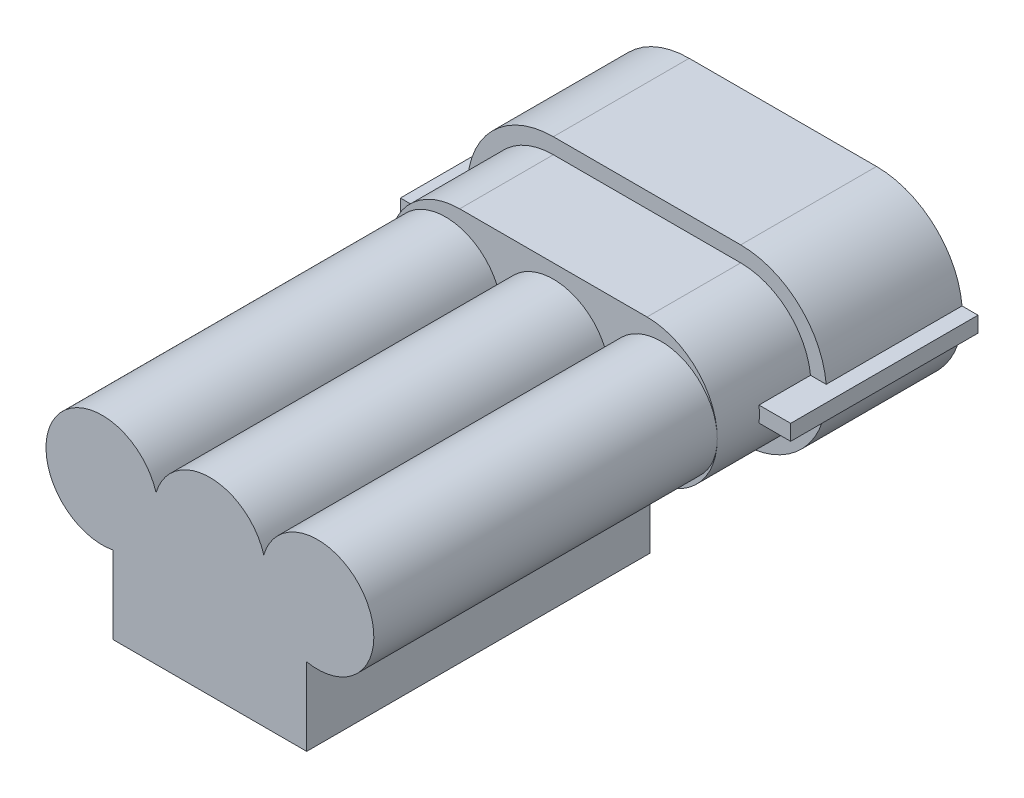
ISO-10303-21;
HEADER;
FILE_DESCRIPTION(('STEP AP214'),'2;1');
FILE_NAME('part.step','',(''),(''),'','','');
FILE_SCHEMA(('AUTOMOTIVE_DESIGN { 1 0 10303 214 1 1 1 1 }'));
ENDSEC;
DATA;
#1=APPLICATION_CONTEXT('core data for automotive mechanical design processes');
#2=APPLICATION_PROTOCOL_DEFINITION('international standard','automotive_design',2000,#1);
#3=PRODUCT_CONTEXT('',#1,'mechanical');
#4=PRODUCT('Part','Part','',(#3));
#5=PRODUCT_RELATED_PRODUCT_CATEGORY('part','',(#4));
#6=PRODUCT_DEFINITION_FORMATION('','',#4);
#7=PRODUCT_DEFINITION_CONTEXT('part definition',#1,'design');
#8=PRODUCT_DEFINITION('design','',#6,#7);
#9=PRODUCT_DEFINITION_SHAPE('','',#8);
#10=(LENGTH_UNIT() NAMED_UNIT(*) SI_UNIT(.MILLI.,.METRE.));
#11=(NAMED_UNIT(*) PLANE_ANGLE_UNIT() SI_UNIT($,.RADIAN.));
#12=(NAMED_UNIT(*) SI_UNIT($,.STERADIAN.) SOLID_ANGLE_UNIT());
#13=UNCERTAINTY_MEASURE_WITH_UNIT(LENGTH_MEASURE(1.E-05),#10,'distance_accuracy_value','');
#14=(GEOMETRIC_REPRESENTATION_CONTEXT(3) GLOBAL_UNCERTAINTY_ASSIGNED_CONTEXT((#13)) GLOBAL_UNIT_ASSIGNED_CONTEXT((#10,
#11,#12)) REPRESENTATION_CONTEXT('',''));
#15=CARTESIAN_POINT('',(0.,0.,0.));
#16=DIRECTION('',(0.,0.,1.));
#17=DIRECTION('',(1.,0.,0.));
#18=AXIS2_PLACEMENT_3D('',#15,#16,#17);
#19=CARTESIAN_POINT('',(-6.,-5.5,8.7));
#20=DIRECTION('',(0.,1.,0.));
#21=DIRECTION('',(0.,0.,1.));
#22=AXIS2_PLACEMENT_3D('',#19,#20,#21);
#23=PLANE('',#22);
#24=DIRECTION('',(1.,0.,0.));
#25=VECTOR('',#24,1.);
#26=CARTESIAN_POINT('',(6.20000000000001,-5.5,14.7));
#27=LINE('',#26,#25);
#28=CARTESIAN_POINT('',(-6.19999999999999,-5.5,14.7));
#29=VERTEX_POINT('',#28);
#30=CARTESIAN_POINT('',(6.20000000000001,-5.5,14.7));
#31=VERTEX_POINT('',#30);
#32=EDGE_CURVE('E60',#29,#31,#27,.T.);
#33=ORIENTED_EDGE('',*,*,#32,.F.);
#34=DIRECTION('',(0.,0.,-1.));
#35=VECTOR('',#34,1.);
#36=CARTESIAN_POINT('',(-6.2,-5.5,36.7));
#37=LINE('',#36,#35);
#38=CARTESIAN_POINT('',(-6.19999999999999,-5.5,0.));
#39=VERTEX_POINT('',#38);
#40=EDGE_CURVE('E405',#29,#39,#37,.T.);
#41=ORIENTED_EDGE('',*,*,#40,.T.);
#42=DIRECTION('',(1.,0.,0.));
#43=VECTOR('',#42,1.);
#44=CARTESIAN_POINT('',(-6.,-5.5,0.));
#45=LINE('',#44,#43);
#46=CARTESIAN_POINT('',(6.2,-5.5,0.));
#47=VERTEX_POINT('',#46);
#48=EDGE_CURVE('E509',#39,#47,#45,.T.);
#49=ORIENTED_EDGE('',*,*,#48,.T.);
#50=DIRECTION('',(0.,0.,1.));
#51=VECTOR('',#50,1.);
#52=CARTESIAN_POINT('',(6.2,-5.5,36.7));
#53=LINE('',#52,#51);
#54=EDGE_CURVE('E401',#47,#31,#53,.T.);
#55=ORIENTED_EDGE('',*,*,#54,.T.);
#56=EDGE_LOOP('',(#33,#41,#49,#55));
#57=FACE_BOUND('',#56,.T.);
#58=ADVANCED_FACE('F41',(#57),#23,.F.);
#59=CARTESIAN_POINT('',(-6.,0.,8.7));
#60=DIRECTION('',(0.,0.,1.));
#61=DIRECTION('',(1.,0.,0.));
#62=AXIS2_PLACEMENT_3D('',#59,#60,#61);
#63=PLANE('',#62);
#64=CARTESIAN_POINT('',(-6.,0.,8.7));
#65=DIRECTION('',(0.,0.,1.));
#66=DIRECTION('',(1.,0.,0.));
#67=AXIS2_PLACEMENT_3D('',#64,#65,#66);
#68=CIRCLE('',#67,4.5);
#69=CARTESIAN_POINT('',(-10.4721359549996,-0.500000000000002,8.7));
#70=VERTEX_POINT('',#69);
#71=CARTESIAN_POINT('',(-6.19999999999999,-4.4955533585978,8.7));
#72=VERTEX_POINT('',#71);
#73=EDGE_CURVE('E458',#70,#72,#68,.T.);
#74=ORIENTED_EDGE('',*,*,#73,.F.);
#75=DIRECTION('',(1.,0.,0.));
#76=VECTOR('',#75,1.);
#77=CARTESIAN_POINT('',(12.502,-0.500000000000001,8.7));
#78=LINE('',#77,#76);
#79=CARTESIAN_POINT('',(-11.4772255750517,-0.500000000000001,8.7));
#80=VERTEX_POINT('',#79);
#81=EDGE_CURVE('E68',#80,#70,#78,.T.);
#82=ORIENTED_EDGE('',*,*,#81,.F.);
#83=CARTESIAN_POINT('',(-6.,0.,8.7));
#84=DIRECTION('',(0.,0.,1.));
#85=DIRECTION('',(1.,0.,0.));
#86=AXIS2_PLACEMENT_3D('',#83,#84,#85);
#87=CIRCLE('',#86,5.5);
#88=CARTESIAN_POINT('',(-6.19999999999999,-5.49636243346452,8.7));
#89=VERTEX_POINT('',#88);
#90=EDGE_CURVE('E497',#80,#89,#87,.T.);
#91=ORIENTED_EDGE('',*,*,#90,.T.);
#92=DIRECTION('',(0.,1.,0.));
#93=VECTOR('',#92,1.);
#94=CARTESIAN_POINT('',(-6.2,5.502,8.7));
#95=LINE('',#94,#93);
#96=EDGE_CURVE('E362',#89,#72,#95,.T.);
#97=ORIENTED_EDGE('',*,*,#96,.T.);
#98=EDGE_LOOP('',(#74,#82,#91,#97));
#99=FACE_BOUND('',#98,.T.);
#100=ADVANCED_FACE('F590',(#99),#63,.T.);
#101=CARTESIAN_POINT('',(-6.,5.5,8.7));
#102=VERTEX_POINT('',#101);
#103=CARTESIAN_POINT('',(-11.4772255750517,0.499999999999999,8.7));
#104=VERTEX_POINT('',#103);
#105=EDGE_CURVE('E492',#102,#104,#87,.T.);
#106=ORIENTED_EDGE('',*,*,#105,.T.);
#107=DIRECTION('',(-1.,0.,0.));
#108=VECTOR('',#107,1.);
#109=CARTESIAN_POINT('',(12.502,0.499999999999999,8.7));
#110=LINE('',#109,#108);
#111=CARTESIAN_POINT('',(-10.4721359549996,0.499999999999999,8.7));
#112=VERTEX_POINT('',#111);
#113=EDGE_CURVE('E283',#112,#104,#110,.T.);
#114=ORIENTED_EDGE('',*,*,#113,.F.);
#115=CARTESIAN_POINT('',(-6.,4.5,8.7));
#116=VERTEX_POINT('',#115);
#117=EDGE_CURVE('E472',#116,#112,#68,.T.);
#118=ORIENTED_EDGE('',*,*,#117,.F.);
#119=DIRECTION('',(-1.,0.,0.));
#120=VECTOR('',#119,1.);
#121=CARTESIAN_POINT('',(6.,4.5,8.7));
#122=LINE('',#121,#120);
#123=CARTESIAN_POINT('',(6.,4.5,8.7));
#124=VERTEX_POINT('',#123);
#125=EDGE_CURVE('E480',#124,#116,#122,.T.);
#126=ORIENTED_EDGE('',*,*,#125,.F.);
#127=CARTESIAN_POINT('',(6.,0.,8.7));
#128=DIRECTION('',(0.,0.,1.));
#129=DIRECTION('',(1.,0.,0.));
#130=AXIS2_PLACEMENT_3D('',#127,#128,#129);
#131=CIRCLE('',#130,4.5);
#132=CARTESIAN_POINT('',(10.4721359549996,0.499999999999999,8.7));
#133=VERTEX_POINT('',#132);
#134=EDGE_CURVE('E475',#133,#124,#131,.T.);
#135=ORIENTED_EDGE('',*,*,#134,.F.);
#136=DIRECTION('',(1.,0.,0.));
#137=VECTOR('',#136,1.);
#138=CARTESIAN_POINT('',(-11.502,0.499999999999999,8.7));
#139=LINE('',#138,#137);
#140=CARTESIAN_POINT('',(11.4772255750517,0.499999999999999,8.7));
#141=VERTEX_POINT('',#140);
#142=EDGE_CURVE('E334',#133,#141,#139,.T.);
#143=ORIENTED_EDGE('',*,*,#142,.T.);
#144=CARTESIAN_POINT('',(6.,0.,8.7));
#145=DIRECTION('',(0.,0.,1.));
#146=DIRECTION('',(1.,0.,0.));
#147=AXIS2_PLACEMENT_3D('',#144,#145,#146);
#148=CIRCLE('',#147,5.5);
#149=CARTESIAN_POINT('',(6.,5.5,8.7));
#150=VERTEX_POINT('',#149);
#151=EDGE_CURVE('E496',#141,#150,#148,.T.);
#152=ORIENTED_EDGE('',*,*,#151,.T.);
#153=DIRECTION('',(-1.,0.,0.));
#154=VECTOR('',#153,1.);
#155=CARTESIAN_POINT('',(-6.,5.5,8.7));
#156=LINE('',#155,#154);
#157=EDGE_CURVE('E502',#150,#102,#156,.T.);
#158=ORIENTED_EDGE('',*,*,#157,.T.);
#159=EDGE_LOOP('',(#106,#114,#118,#126,#135,#143,#152,#158));
#160=FACE_BOUND('',#159,.T.);
#161=ADVANCED_FACE('F560',(#160),#63,.T.);
#162=CARTESIAN_POINT('',(-6.,0.,8.7));
#163=DIRECTION('',(0.,0.,-1.));
#164=DIRECTION('',(-1.,0.,0.));
#165=AXIS2_PLACEMENT_3D('',#162,#163,#164);
#166=CYLINDRICAL_SURFACE('',#165,5.5);
#167=DIRECTION('',(0.,0.,-1.));
#168=VECTOR('',#167,1.);
#169=CARTESIAN_POINT('',(-11.4772255750517,-0.500000000000001,8.7));
#170=LINE('',#169,#168);
#171=CARTESIAN_POINT('',(-11.4772255750517,-0.5,0.));
#172=VERTEX_POINT('',#171);
#173=EDGE_CURVE('E319',#80,#172,#170,.T.);
#174=ORIENTED_EDGE('',*,*,#173,.T.);
#175=CARTESIAN_POINT('',(-6.,0.,0.));
#176=DIRECTION('',(0.,0.,1.));
#177=DIRECTION('',(1.,0.,0.));
#178=AXIS2_PLACEMENT_3D('',#175,#176,#177);
#179=CIRCLE('',#178,5.5);
#180=CARTESIAN_POINT('',(-6.19999999999999,-5.49636243346452,0.));
#181=VERTEX_POINT('',#180);
#182=EDGE_CURVE('E491',#172,#181,#179,.T.);
#183=ORIENTED_EDGE('',*,*,#182,.T.);
#184=DIRECTION('',(0.,0.,-1.));
#185=VECTOR('',#184,1.);
#186=CARTESIAN_POINT('',(-6.19999999999999,-5.49636243346452,8.7));
#187=LINE('',#186,#185);
#188=EDGE_CURVE('E249',#89,#181,#187,.T.);
#189=ORIENTED_EDGE('',*,*,#188,.F.);
#190=ORIENTED_EDGE('',*,*,#90,.F.);
#191=EDGE_LOOP('',(#174,#183,#189,#190));
#192=FACE_BOUND('',#191,.T.);
#193=ADVANCED_FACE('F43',(#192),#166,.T.);
#194=DIRECTION('',(0.,0.,-1.));
#195=VECTOR('',#194,1.);
#196=CARTESIAN_POINT('',(-11.4772255750517,0.499999999999999,8.7));
#197=LINE('',#196,#195);
#198=CARTESIAN_POINT('',(-11.4772255750517,0.5,0.));
#199=VERTEX_POINT('',#198);
#200=EDGE_CURVE('E280',#199,#104,#197,.F.);
#201=ORIENTED_EDGE('',*,*,#200,.T.);
#202=ORIENTED_EDGE('',*,*,#105,.F.);
#203=DIRECTION('',(0.,0.,-1.));
#204=VECTOR('',#203,1.);
#205=CARTESIAN_POINT('',(-6.,5.5,8.7));
#206=LINE('',#205,#204);
#207=CARTESIAN_POINT('',(-6.,5.5,0.));
#208=VERTEX_POINT('',#207);
#209=EDGE_CURVE('E505',#102,#208,#206,.T.);
#210=ORIENTED_EDGE('',*,*,#209,.T.);
#211=EDGE_CURVE('E506',#208,#199,#179,.T.);
#212=ORIENTED_EDGE('',*,*,#211,.T.);
#213=EDGE_LOOP('',(#201,#202,#210,#212));
#214=FACE_BOUND('',#213,.T.);
#215=ADVANCED_FACE('F603',(#214),#166,.T.);
#216=CARTESIAN_POINT('',(-6.,0.,14.7));
#217=DIRECTION('',(0.,0.,-1.));
#218=DIRECTION('',(-1.,0.,0.));
#219=AXIS2_PLACEMENT_3D('',#216,#217,#218);
#220=CYLINDRICAL_SURFACE('',#219,4.5);
#221=DIRECTION('',(0.,0.,-1.));
#222=VECTOR('',#221,1.);
#223=CARTESIAN_POINT('',(-10.4721359549996,-0.500000000000002,14.7));
#224=LINE('',#223,#222);
#225=CARTESIAN_POINT('',(-10.4721359549996,-0.500000000000002,12.));
#226=VERTEX_POINT('',#225);
#227=EDGE_CURVE('E284',#226,#70,#224,.T.);
#228=ORIENTED_EDGE('',*,*,#227,.T.);
#229=ORIENTED_EDGE('',*,*,#73,.T.);
#230=DIRECTION('',(0.,0.,-1.));
#231=VECTOR('',#230,1.);
#232=CARTESIAN_POINT('',(-6.19999999999999,-4.4955533585978,14.7));
#233=LINE('',#232,#231);
#234=CARTESIAN_POINT('',(-6.19999999999999,-4.4955533585978,14.7));
#235=VERTEX_POINT('',#234);
#236=EDGE_CURVE('E389',#235,#72,#233,.T.);
#237=ORIENTED_EDGE('',*,*,#236,.F.);
#238=CARTESIAN_POINT('',(-6.,0.,14.7));
#239=DIRECTION('',(0.,0.,1.));
#240=DIRECTION('',(1.,0.,0.));
#241=AXIS2_PLACEMENT_3D('',#238,#239,#240);
#242=CIRCLE('',#241,4.5);
#243=CARTESIAN_POINT('',(-10.5,0.,14.7));
#244=VERTEX_POINT('',#243);
#245=EDGE_CURVE('E464',#244,#235,#242,.T.);
#246=ORIENTED_EDGE('',*,*,#245,.F.);
#247=CARTESIAN_POINT('',(-6.,4.5,14.7));
#248=VERTEX_POINT('',#247);
#249=EDGE_CURVE('E459',#248,#244,#242,.T.);
#250=ORIENTED_EDGE('',*,*,#249,.F.);
#251=DIRECTION('',(0.,0.,-1.));
#252=VECTOR('',#251,1.);
#253=CARTESIAN_POINT('',(-6.,4.5,14.7));
#254=LINE('',#253,#252);
#255=EDGE_CURVE('E471',#248,#116,#254,.T.);
#256=ORIENTED_EDGE('',*,*,#255,.T.);
#257=ORIENTED_EDGE('',*,*,#117,.T.);
#258=DIRECTION('',(0.,0.,-1.));
#259=VECTOR('',#258,1.);
#260=CARTESIAN_POINT('',(-10.4721359549996,0.499999999999998,14.7));
#261=LINE('',#260,#259);
#262=CARTESIAN_POINT('',(-10.4721359549996,0.499999999999998,12.));
#263=VERTEX_POINT('',#262);
#264=EDGE_CURVE('E325',#112,#263,#261,.F.);
#265=ORIENTED_EDGE('',*,*,#264,.T.);
#266=CARTESIAN_POINT('',(-6.,0.,12.));
#267=DIRECTION('',(0.,0.,-1.));
#268=DIRECTION('',(-1.,0.,0.));
#269=AXIS2_PLACEMENT_3D('',#266,#267,#268);
#270=CIRCLE('',#269,4.5);
#271=EDGE_CURVE('E322',#263,#226,#270,.F.);
#272=ORIENTED_EDGE('',*,*,#271,.T.);
#273=EDGE_LOOP('',(#228,#229,#237,#246,#250,#256,#257,#265,#272));
#274=FACE_BOUND('',#273,.T.);
#275=ADVANCED_FACE('F544',(#274),#220,.T.);
#276=CARTESIAN_POINT('',(6.,0.,8.7));
#277=DIRECTION('',(0.,0.,-1.));
#278=DIRECTION('',(-1.,0.,0.));
#279=AXIS2_PLACEMENT_3D('',#276,#277,#278);
#280=CYLINDRICAL_SURFACE('',#279,5.5);
#281=ORIENTED_EDGE('',*,*,#151,.F.);
#282=DIRECTION('',(0.,0.,-1.));
#283=VECTOR('',#282,1.);
#284=CARTESIAN_POINT('',(11.4772255750517,0.499999999999999,8.7));
#285=LINE('',#284,#283);
#286=CARTESIAN_POINT('',(11.4772255750517,0.5,0.));
#287=VERTEX_POINT('',#286);
#288=EDGE_CURVE('E333',#287,#141,#285,.F.);
#289=ORIENTED_EDGE('',*,*,#288,.F.);
#290=CARTESIAN_POINT('',(6.,0.,0.));
#291=DIRECTION('',(0.,0.,1.));
#292=DIRECTION('',(1.,0.,0.));
#293=AXIS2_PLACEMENT_3D('',#290,#291,#292);
#294=CIRCLE('',#293,5.5);
#295=CARTESIAN_POINT('',(6.,5.5,0.));
#296=VERTEX_POINT('',#295);
#297=EDGE_CURVE('E512',#287,#296,#294,.T.);
#298=ORIENTED_EDGE('',*,*,#297,.T.);
#299=DIRECTION('',(0.,0.,-1.));
#300=VECTOR('',#299,1.);
#301=CARTESIAN_POINT('',(6.,5.5,8.7));
#302=LINE('',#301,#300);
#303=EDGE_CURVE('E45',#150,#296,#302,.T.);
#304=ORIENTED_EDGE('',*,*,#303,.F.);
#305=EDGE_LOOP('',(#281,#289,#298,#304));
#306=FACE_BOUND('',#305,.T.);
#307=ADVANCED_FACE('F598',(#306),#280,.T.);
#308=CARTESIAN_POINT('',(-6.,0.,14.7));
#309=DIRECTION('',(0.,0.,1.));
#310=DIRECTION('',(1.,0.,0.));
#311=AXIS2_PLACEMENT_3D('',#308,#309,#310);
#312=PLANE('',#311);
#313=DIRECTION('',(0.,1.,0.));
#314=VECTOR('',#313,1.);
#315=CARTESIAN_POINT('',(-6.2,5.502,14.7));
#316=LINE('',#315,#314);
#317=CARTESIAN_POINT('',(-6.19999999999999,-3.53128871660191,14.7));
#318=VERTEX_POINT('',#317);
#319=EDGE_CURVE('E425',#235,#318,#316,.T.);
#320=ORIENTED_EDGE('',*,*,#319,.T.);
#321=CARTESIAN_POINT('',(-6.9,0.,14.7));
#322=DIRECTION('',(0.,0.,1.));
#323=DIRECTION('',(1.,0.,0.));
#324=AXIS2_PLACEMENT_3D('',#321,#322,#323);
#325=CIRCLE('',#324,3.6);
#326=EDGE_CURVE('E51',#244,#318,#325,.T.);
#327=ORIENTED_EDGE('',*,*,#326,.F.);
#328=ORIENTED_EDGE('',*,*,#245,.T.);
#329=EDGE_LOOP('',(#320,#327,#328));
#330=FACE_BOUND('',#329,.T.);
#331=ADVANCED_FACE('F540',(#330),#312,.T.);
#332=CARTESIAN_POINT('',(0.,0.,14.7));
#333=DIRECTION('',(0.,0.,1.));
#334=DIRECTION('',(1.,0.,0.));
#335=AXIS2_PLACEMENT_3D('',#332,#333,#334);
#336=CIRCLE('',#335,3.6);
#337=CARTESIAN_POINT('',(3.45,1.02834819006015,14.7));
#338=VERTEX_POINT('',#337);
#339=CARTESIAN_POINT('',(-3.45,1.02834819006016,14.7));
#340=VERTEX_POINT('',#339);
#341=EDGE_CURVE('E436',#338,#340,#336,.T.);
#342=ORIENTED_EDGE('',*,*,#341,.F.);
#343=CARTESIAN_POINT('',(6.9,0.,14.7));
#344=DIRECTION('',(0.,0.,1.));
#345=DIRECTION('',(1.,0.,0.));
#346=AXIS2_PLACEMENT_3D('',#343,#344,#345);
#347=CIRCLE('',#346,3.6);
#348=CARTESIAN_POINT('',(10.5,0.,14.7));
#349=VERTEX_POINT('',#348);
#350=EDGE_CURVE('E11',#349,#338,#347,.T.);
#351=ORIENTED_EDGE('',*,*,#350,.F.);
#352=CARTESIAN_POINT('',(6.,0.,14.7));
#353=DIRECTION('',(0.,0.,1.));
#354=DIRECTION('',(1.,0.,0.));
#355=AXIS2_PLACEMENT_3D('',#352,#353,#354);
#356=CIRCLE('',#355,4.5);
#357=CARTESIAN_POINT('',(6.,4.5,14.7));
#358=VERTEX_POINT('',#357);
#359=EDGE_CURVE('E463',#349,#358,#356,.T.);
#360=ORIENTED_EDGE('',*,*,#359,.T.);
#361=DIRECTION('',(-1.,0.,0.));
#362=VECTOR('',#361,1.);
#363=CARTESIAN_POINT('',(6.,4.5,14.7));
#364=LINE('',#363,#362);
#365=EDGE_CURVE('E468',#358,#248,#364,.T.);
#366=ORIENTED_EDGE('',*,*,#365,.T.);
#367=ORIENTED_EDGE('',*,*,#249,.T.);
#368=EDGE_CURVE('E404',#340,#244,#325,.T.);
#369=ORIENTED_EDGE('',*,*,#368,.F.);
#370=EDGE_LOOP('',(#342,#351,#360,#366,#367,#369));
#371=FACE_BOUND('',#370,.T.);
#372=ADVANCED_FACE('F547',(#371),#312,.T.);
#373=CARTESIAN_POINT('',(6.2,-5.49636243346452,0.));
#374=VERTEX_POINT('',#373);
#375=CARTESIAN_POINT('',(11.4772255750517,-0.5,0.));
#376=VERTEX_POINT('',#375);
#377=EDGE_CURVE('E513',#374,#376,#294,.T.);
#378=ORIENTED_EDGE('',*,*,#377,.T.);
#379=DIRECTION('',(0.,0.,-1.));
#380=VECTOR('',#379,1.);
#381=CARTESIAN_POINT('',(11.4772255750517,-0.500000000000001,8.7));
#382=LINE('',#381,#380);
#383=CARTESIAN_POINT('',(11.4772255750517,-0.500000000000001,8.7));
#384=VERTEX_POINT('',#383);
#385=EDGE_CURVE('E344',#384,#376,#382,.T.);
#386=ORIENTED_EDGE('',*,*,#385,.F.);
#387=CARTESIAN_POINT('',(6.2,-5.49636243346452,8.7));
#388=VERTEX_POINT('',#387);
#389=EDGE_CURVE('E498',#388,#384,#148,.T.);
#390=ORIENTED_EDGE('',*,*,#389,.F.);
#391=DIRECTION('',(0.,0.,-1.));
#392=VECTOR('',#391,1.);
#393=CARTESIAN_POINT('',(6.2,-5.49636243346452,8.7));
#394=LINE('',#393,#392);
#395=EDGE_CURVE('E390',#374,#388,#394,.F.);
#396=ORIENTED_EDGE('',*,*,#395,.F.);
#397=EDGE_LOOP('',(#378,#386,#390,#396));
#398=FACE_BOUND('',#397,.T.);
#399=ADVANCED_FACE('F625',(#398),#280,.T.);
#400=CARTESIAN_POINT('',(-6.,5.5,8.7));
#401=DIRECTION('',(0.,-1.,0.));
#402=DIRECTION('',(0.,0.,-1.));
#403=AXIS2_PLACEMENT_3D('',#400,#401,#402);
#404=PLANE('',#403);
#405=DIRECTION('',(-1.,0.,0.));
#406=VECTOR('',#405,1.);
#407=CARTESIAN_POINT('',(-6.,5.5,0.));
#408=LINE('',#407,#406);
#409=EDGE_CURVE('E517',#296,#208,#408,.T.);
#410=ORIENTED_EDGE('',*,*,#409,.T.);
#411=ORIENTED_EDGE('',*,*,#209,.F.);
#412=ORIENTED_EDGE('',*,*,#157,.F.);
#413=ORIENTED_EDGE('',*,*,#303,.T.);
#414=EDGE_LOOP('',(#410,#411,#412,#413));
#415=FACE_BOUND('',#414,.T.);
#416=ADVANCED_FACE('F602',(#415),#404,.F.);
#417=DIRECTION('',(-1.,0.,0.));
#418=VECTOR('',#417,1.);
#419=CARTESIAN_POINT('',(-11.502,-0.500000000000001,8.7));
#420=LINE('',#419,#418);
#421=CARTESIAN_POINT('',(10.4721359549996,-0.500000000000001,8.7));
#422=VERTEX_POINT('',#421);
#423=EDGE_CURVE('E303',#384,#422,#420,.T.);
#424=ORIENTED_EDGE('',*,*,#423,.T.);
#425=CARTESIAN_POINT('',(6.2,-4.4955533585978,8.7));
#426=VERTEX_POINT('',#425);
#427=EDGE_CURVE('E476',#426,#422,#131,.T.);
#428=ORIENTED_EDGE('',*,*,#427,.F.);
#429=DIRECTION('',(0.,-1.,0.));
#430=VECTOR('',#429,1.);
#431=CARTESIAN_POINT('',(6.2,5.502,8.7));
#432=LINE('',#431,#430);
#433=EDGE_CURVE('E421',#426,#388,#432,.T.);
#434=ORIENTED_EDGE('',*,*,#433,.T.);
#435=ORIENTED_EDGE('',*,*,#389,.T.);
#436=EDGE_LOOP('',(#424,#428,#434,#435));
#437=FACE_BOUND('',#436,.T.);
#438=ADVANCED_FACE('F623',(#437),#63,.T.);
#439=CARTESIAN_POINT('',(-6.,0.,0.));
#440=DIRECTION('',(0.,0.,1.));
#441=DIRECTION('',(1.,0.,0.));
#442=AXIS2_PLACEMENT_3D('',#439,#440,#441);
#443=PLANE('',#442);
#444=ORIENTED_EDGE('',*,*,#211,.F.);
#445=ORIENTED_EDGE('',*,*,#409,.F.);
#446=ORIENTED_EDGE('',*,*,#297,.F.);
#447=DIRECTION('',(1.,0.,0.));
#448=VECTOR('',#447,1.);
#449=CARTESIAN_POINT('',(-11.502,0.5,0.));
#450=LINE('',#449,#448);
#451=CARTESIAN_POINT('',(12.5,0.5,0.));
#452=VERTEX_POINT('',#451);
#453=EDGE_CURVE('E347',#287,#452,#450,.T.);
#454=ORIENTED_EDGE('',*,*,#453,.T.);
#455=DIRECTION('',(0.,1.,0.));
#456=VECTOR('',#455,1.);
#457=CARTESIAN_POINT('',(12.5,-0.5,0.));
#458=LINE('',#457,#456);
#459=CARTESIAN_POINT('',(12.5,-0.5,0.));
#460=VERTEX_POINT('',#459);
#461=EDGE_CURVE('E358',#460,#452,#458,.T.);
#462=ORIENTED_EDGE('',*,*,#461,.F.);
#463=DIRECTION('',(1.,0.,0.));
#464=VECTOR('',#463,1.);
#465=CARTESIAN_POINT('',(-11.502,-0.5,0.));
#466=LINE('',#465,#464);
#467=EDGE_CURVE('E357',#376,#460,#466,.T.);
#468=ORIENTED_EDGE('',*,*,#467,.F.);
#469=ORIENTED_EDGE('',*,*,#377,.F.);
#470=DIRECTION('',(0.,-1.,0.));
#471=VECTOR('',#470,1.);
#472=CARTESIAN_POINT('',(6.2,5.502,0.));
#473=LINE('',#472,#471);
#474=EDGE_CURVE('E407',#374,#47,#473,.T.);
#475=ORIENTED_EDGE('',*,*,#474,.T.);
#476=ORIENTED_EDGE('',*,*,#48,.F.);
#477=DIRECTION('',(0.,-1.,0.));
#478=VECTOR('',#477,1.);
#479=CARTESIAN_POINT('',(-6.19999999999999,5.502,0.));
#480=LINE('',#479,#478);
#481=EDGE_CURVE('E411',#181,#39,#480,.T.);
#482=ORIENTED_EDGE('',*,*,#481,.F.);
#483=ORIENTED_EDGE('',*,*,#182,.F.);
#484=DIRECTION('',(-1.,0.,0.));
#485=VECTOR('',#484,1.);
#486=CARTESIAN_POINT('',(12.502,-0.5,0.));
#487=LINE('',#486,#485);
#488=CARTESIAN_POINT('',(-12.5,-0.5,0.));
#489=VERTEX_POINT('',#488);
#490=EDGE_CURVE('E288',#172,#489,#487,.T.);
#491=ORIENTED_EDGE('',*,*,#490,.T.);
#492=DIRECTION('',(0.,1.,0.));
#493=VECTOR('',#492,1.);
#494=CARTESIAN_POINT('',(-12.5,-0.5,0.));
#495=LINE('',#494,#493);
#496=CARTESIAN_POINT('',(-12.5,0.5,0.));
#497=VERTEX_POINT('',#496);
#498=EDGE_CURVE('E299',#489,#497,#495,.T.);
#499=ORIENTED_EDGE('',*,*,#498,.T.);
#500=DIRECTION('',(-1.,0.,0.));
#501=VECTOR('',#500,1.);
#502=CARTESIAN_POINT('',(12.502,0.5,0.));
#503=LINE('',#502,#501);
#504=EDGE_CURVE('E298',#199,#497,#503,.T.);
#505=ORIENTED_EDGE('',*,*,#504,.F.);
#506=EDGE_LOOP('',(#444,#445,#446,#454,#462,#468,#469,#475,#476,#482,#483,#491,#499,#505));
#507=FACE_BOUND('',#506,.T.);
#508=ADVANCED_FACE('F581',(#507),#443,.F.);
#509=CARTESIAN_POINT('',(6.,0.,14.7));
#510=DIRECTION('',(0.,0.,-1.));
#511=DIRECTION('',(-1.,0.,0.));
#512=AXIS2_PLACEMENT_3D('',#509,#510,#511);
#513=CYLINDRICAL_SURFACE('',#512,4.5);
#514=CARTESIAN_POINT('',(6.,0.,12.));
#515=DIRECTION('',(0.,0.,1.));
#516=DIRECTION('',(1.,0.,0.));
#517=AXIS2_PLACEMENT_3D('',#514,#515,#516);
#518=CIRCLE('',#517,4.5);
#519=CARTESIAN_POINT('',(10.4721359549996,0.499999999999999,12.));
#520=VERTEX_POINT('',#519);
#521=CARTESIAN_POINT('',(10.4721359549996,-0.500000000000002,12.));
#522=VERTEX_POINT('',#521);
#523=EDGE_CURVE('E335',#520,#522,#518,.F.);
#524=ORIENTED_EDGE('',*,*,#523,.F.);
#525=DIRECTION('',(0.,0.,-1.));
#526=VECTOR('',#525,1.);
#527=CARTESIAN_POINT('',(10.4721359549996,0.499999999999998,14.7));
#528=LINE('',#527,#526);
#529=EDGE_CURVE('E330',#133,#520,#528,.F.);
#530=ORIENTED_EDGE('',*,*,#529,.F.);
#531=ORIENTED_EDGE('',*,*,#134,.T.);
#532=DIRECTION('',(0.,0.,-1.));
#533=VECTOR('',#532,1.);
#534=CARTESIAN_POINT('',(6.,4.5,14.7));
#535=LINE('',#534,#533);
#536=EDGE_CURVE('E487',#358,#124,#535,.T.);
#537=ORIENTED_EDGE('',*,*,#536,.F.);
#538=ORIENTED_EDGE('',*,*,#359,.F.);
#539=CARTESIAN_POINT('',(6.2,-4.4955533585978,14.7));
#540=VERTEX_POINT('',#539);
#541=EDGE_CURVE('E465',#540,#349,#356,.T.);
#542=ORIENTED_EDGE('',*,*,#541,.F.);
#543=DIRECTION('',(0.,0.,-1.));
#544=VECTOR('',#543,1.);
#545=CARTESIAN_POINT('',(6.2,-4.4955533585978,14.7));
#546=LINE('',#545,#544);
#547=EDGE_CURVE('E384',#426,#540,#546,.F.);
#548=ORIENTED_EDGE('',*,*,#547,.F.);
#549=ORIENTED_EDGE('',*,*,#427,.T.);
#550=DIRECTION('',(0.,0.,-1.));
#551=VECTOR('',#550,1.);
#552=CARTESIAN_POINT('',(10.4721359549996,-0.500000000000002,14.7));
#553=LINE('',#552,#551);
#554=EDGE_CURVE('E339',#522,#422,#553,.T.);
#555=ORIENTED_EDGE('',*,*,#554,.F.);
#556=EDGE_LOOP('',(#524,#530,#531,#537,#538,#542,#548,#549,#555));
#557=FACE_BOUND('',#556,.T.);
#558=ADVANCED_FACE('F632',(#557),#513,.T.);
#559=CARTESIAN_POINT('',(6.,4.5,14.7));
#560=DIRECTION('',(0.,-1.,0.));
#561=DIRECTION('',(1.,0.,0.));
#562=AXIS2_PLACEMENT_3D('',#559,#560,#561);
#563=PLANE('',#562);
#564=ORIENTED_EDGE('',*,*,#125,.T.);
#565=ORIENTED_EDGE('',*,*,#255,.F.);
#566=ORIENTED_EDGE('',*,*,#365,.F.);
#567=ORIENTED_EDGE('',*,*,#536,.T.);
#568=EDGE_LOOP('',(#564,#565,#566,#567));
#569=FACE_BOUND('',#568,.T.);
#570=ADVANCED_FACE('F554',(#569),#563,.F.);
#571=DIRECTION('',(0.,-1.,0.));
#572=VECTOR('',#571,1.);
#573=CARTESIAN_POINT('',(6.2,5.502,14.7));
#574=LINE('',#573,#572);
#575=CARTESIAN_POINT('',(6.2,-3.53128871660192,14.7));
#576=VERTEX_POINT('',#575);
#577=EDGE_CURVE('E385',#576,#540,#574,.T.);
#578=ORIENTED_EDGE('',*,*,#577,.T.);
#579=ORIENTED_EDGE('',*,*,#541,.T.);
#580=EDGE_CURVE('E53',#576,#349,#347,.T.);
#581=ORIENTED_EDGE('',*,*,#580,.F.);
#582=EDGE_LOOP('',(#578,#579,#581));
#583=FACE_BOUND('',#582,.T.);
#584=ADVANCED_FACE('F643',(#583),#312,.T.);
#585=CARTESIAN_POINT('',(-6.9,0.,36.7));
#586=DIRECTION('',(0.,0.,-1.));
#587=DIRECTION('',(-1.,0.,0.));
#588=AXIS2_PLACEMENT_3D('',#585,#586,#587);
#589=CYLINDRICAL_SURFACE('',#588,3.6);
#590=ORIENTED_EDGE('',*,*,#326,.T.);
#591=DIRECTION('',(0.,0.,-1.));
#592=VECTOR('',#591,1.);
#593=CARTESIAN_POINT('',(-6.2,-3.53128871660191,36.7));
#594=LINE('',#593,#592);
#595=CARTESIAN_POINT('',(-6.2,-3.53128871660191,36.7));
#596=VERTEX_POINT('',#595);
#597=EDGE_CURVE('E393',#596,#318,#594,.T.);
#598=ORIENTED_EDGE('',*,*,#597,.F.);
#599=CARTESIAN_POINT('',(-6.9,0.,36.7));
#600=DIRECTION('',(0.,0.,1.));
#601=DIRECTION('',(1.,0.,0.));
#602=AXIS2_PLACEMENT_3D('',#599,#600,#601);
#603=CIRCLE('',#602,3.6);
#604=CARTESIAN_POINT('',(-3.45,1.02834819006016,36.7));
#605=VERTEX_POINT('',#604);
#606=EDGE_CURVE('E432',#605,#596,#603,.T.);
#607=ORIENTED_EDGE('',*,*,#606,.F.);
#608=DIRECTION('',(0.,0.,-1.));
#609=VECTOR('',#608,1.);
#610=CARTESIAN_POINT('',(-3.45,1.02834819006016,36.7));
#611=LINE('',#610,#609);
#612=EDGE_CURVE('E442',#605,#340,#611,.T.);
#613=ORIENTED_EDGE('',*,*,#612,.T.);
#614=ORIENTED_EDGE('',*,*,#368,.T.);
#615=EDGE_LOOP('',(#590,#598,#607,#613,#614));
#616=FACE_BOUND('',#615,.T.);
#617=ADVANCED_FACE('F535',(#616),#589,.T.);
#618=CARTESIAN_POINT('',(6.9,0.,36.7));
#619=DIRECTION('',(0.,0.,-1.));
#620=DIRECTION('',(-1.,0.,0.));
#621=AXIS2_PLACEMENT_3D('',#618,#619,#620);
#622=CYLINDRICAL_SURFACE('',#621,3.6);
#623=CARTESIAN_POINT('',(6.9,0.,36.7));
#624=DIRECTION('',(0.,0.,1.));
#625=DIRECTION('',(1.,0.,0.));
#626=AXIS2_PLACEMENT_3D('',#623,#624,#625);
#627=CIRCLE('',#626,3.6);
#628=CARTESIAN_POINT('',(6.2,-3.53128871660192,36.7));
#629=VERTEX_POINT('',#628);
#630=CARTESIAN_POINT('',(3.45,1.02834819006015,36.7));
#631=VERTEX_POINT('',#630);
#632=EDGE_CURVE('E435',#629,#631,#627,.T.);
#633=ORIENTED_EDGE('',*,*,#632,.F.);
#634=DIRECTION('',(0.,0.,-1.));
#635=VECTOR('',#634,1.);
#636=CARTESIAN_POINT('',(6.2,-3.53128871660192,36.7));
#637=LINE('',#636,#635);
#638=EDGE_CURVE('E244',#576,#629,#637,.F.);
#639=ORIENTED_EDGE('',*,*,#638,.F.);
#640=ORIENTED_EDGE('',*,*,#580,.T.);
#641=ORIENTED_EDGE('',*,*,#350,.T.);
#642=DIRECTION('',(0.,0.,-1.));
#643=VECTOR('',#642,1.);
#644=CARTESIAN_POINT('',(3.45,1.02834819006015,36.7));
#645=LINE('',#644,#643);
#646=EDGE_CURVE('E454',#631,#338,#645,.T.);
#647=ORIENTED_EDGE('',*,*,#646,.F.);
#648=EDGE_LOOP('',(#633,#639,#640,#641,#647));
#649=FACE_BOUND('',#648,.T.);
#650=ADVANCED_FACE('F649',(#649),#622,.T.);
#651=CARTESIAN_POINT('',(0.,0.,36.7));
#652=DIRECTION('',(0.,0.,-1.));
#653=DIRECTION('',(-1.,0.,0.));
#654=AXIS2_PLACEMENT_3D('',#651,#652,#653);
#655=CYLINDRICAL_SURFACE('',#654,3.6);
#656=ORIENTED_EDGE('',*,*,#341,.T.);
#657=ORIENTED_EDGE('',*,*,#612,.F.);
#658=CARTESIAN_POINT('',(0.,0.,36.7));
#659=DIRECTION('',(0.,0.,1.));
#660=DIRECTION('',(1.,0.,0.));
#661=AXIS2_PLACEMENT_3D('',#658,#659,#660);
#662=CIRCLE('',#661,3.6);
#663=EDGE_CURVE('E439',#631,#605,#662,.T.);
#664=ORIENTED_EDGE('',*,*,#663,.F.);
#665=ORIENTED_EDGE('',*,*,#646,.T.);
#666=EDGE_LOOP('',(#656,#657,#664,#665));
#667=FACE_BOUND('',#666,.T.);
#668=ADVANCED_FACE('F652',(#667),#655,.T.);
#669=CARTESIAN_POINT('',(0.,0.,36.7));
#670=DIRECTION('',(0.,0.,1.));
#671=DIRECTION('',(1.,0.,0.));
#672=AXIS2_PLACEMENT_3D('',#669,#670,#671);
#673=PLANE('',#672);
#674=DIRECTION('',(0.,-1.,0.));
#675=VECTOR('',#674,1.);
#676=CARTESIAN_POINT('',(6.2,5.502,36.7));
#677=LINE('',#676,#675);
#678=CARTESIAN_POINT('',(6.2,-8.5,36.7));
#679=VERTEX_POINT('',#678);
#680=EDGE_CURVE('E237',#629,#679,#677,.T.);
#681=ORIENTED_EDGE('',*,*,#680,.F.);
#682=ORIENTED_EDGE('',*,*,#632,.T.);
#683=ORIENTED_EDGE('',*,*,#663,.T.);
#684=ORIENTED_EDGE('',*,*,#606,.T.);
#685=DIRECTION('',(0.,-1.,0.));
#686=VECTOR('',#685,1.);
#687=CARTESIAN_POINT('',(-6.2,5.502,36.7));
#688=LINE('',#687,#686);
#689=CARTESIAN_POINT('',(-6.2,-8.5,36.7));
#690=VERTEX_POINT('',#689);
#691=EDGE_CURVE('E248',#596,#690,#688,.T.);
#692=ORIENTED_EDGE('',*,*,#691,.T.);
#693=DIRECTION('',(-1.,0.,0.));
#694=VECTOR('',#693,1.);
#695=CARTESIAN_POINT('',(6.2,-8.5,36.7));
#696=LINE('',#695,#694);
#697=EDGE_CURVE('E252',#679,#690,#696,.T.);
#698=ORIENTED_EDGE('',*,*,#697,.F.);
#699=EDGE_LOOP('',(#681,#682,#683,#684,#692,#698));
#700=FACE_BOUND('',#699,.T.);
#701=ADVANCED_FACE('F253',(#700),#673,.T.);
#702=CARTESIAN_POINT('',(-6.2,5.502,36.7));
#703=DIRECTION('',(-1.,0.,0.));
#704=DIRECTION('',(0.,-1.,0.));
#705=AXIS2_PLACEMENT_3D('',#702,#703,#704);
#706=PLANE('',#705);
#707=ORIENTED_EDGE('',*,*,#691,.F.);
#708=ORIENTED_EDGE('',*,*,#597,.T.);
#709=ORIENTED_EDGE('',*,*,#319,.F.);
#710=ORIENTED_EDGE('',*,*,#236,.T.);
#711=ORIENTED_EDGE('',*,*,#96,.F.);
#712=ORIENTED_EDGE('',*,*,#188,.T.);
#713=ORIENTED_EDGE('',*,*,#481,.T.);
#714=ORIENTED_EDGE('',*,*,#40,.F.);
#715=DIRECTION('',(0.,1.,0.));
#716=VECTOR('',#715,1.);
#717=CARTESIAN_POINT('',(-6.19999999999999,-8.5,14.7));
#718=LINE('',#717,#716);
#719=CARTESIAN_POINT('',(-6.19999999999999,-8.5,14.7));
#720=VERTEX_POINT('',#719);
#721=EDGE_CURVE('E276',#720,#29,#718,.T.);
#722=ORIENTED_EDGE('',*,*,#721,.F.);
#723=DIRECTION('',(0.,0.,-1.));
#724=VECTOR('',#723,1.);
#725=CARTESIAN_POINT('',(-6.2,-8.5,36.7));
#726=LINE('',#725,#724);
#727=EDGE_CURVE('E258',#690,#720,#726,.T.);
#728=ORIENTED_EDGE('',*,*,#727,.F.);
#729=EDGE_LOOP('',(#707,#708,#709,#710,#711,#712,#713,#714,#722,#728));
#730=FACE_BOUND('',#729,.T.);
#731=ADVANCED_FACE('F589',(#730),#706,.T.);
#732=CARTESIAN_POINT('',(6.2,5.502,36.7));
#733=DIRECTION('',(1.,0.,0.));
#734=DIRECTION('',(0.,1.,0.));
#735=AXIS2_PLACEMENT_3D('',#732,#733,#734);
#736=PLANE('',#735);
#737=ORIENTED_EDGE('',*,*,#577,.F.);
#738=ORIENTED_EDGE('',*,*,#638,.T.);
#739=ORIENTED_EDGE('',*,*,#680,.T.);
#740=DIRECTION('',(0.,0.,1.));
#741=VECTOR('',#740,1.);
#742=CARTESIAN_POINT('',(6.2,-8.5,36.7));
#743=LINE('',#742,#741);
#744=CARTESIAN_POINT('',(6.20000000000001,-8.5,14.7));
#745=VERTEX_POINT('',#744);
#746=EDGE_CURVE('E242',#745,#679,#743,.T.);
#747=ORIENTED_EDGE('',*,*,#746,.F.);
#748=DIRECTION('',(0.,1.,0.));
#749=VECTOR('',#748,1.);
#750=CARTESIAN_POINT('',(6.20000000000001,-8.5,14.7));
#751=LINE('',#750,#749);
#752=EDGE_CURVE('E272',#745,#31,#751,.T.);
#753=ORIENTED_EDGE('',*,*,#752,.T.);
#754=ORIENTED_EDGE('',*,*,#54,.F.);
#755=ORIENTED_EDGE('',*,*,#474,.F.);
#756=ORIENTED_EDGE('',*,*,#395,.T.);
#757=ORIENTED_EDGE('',*,*,#433,.F.);
#758=ORIENTED_EDGE('',*,*,#547,.T.);
#759=EDGE_LOOP('',(#737,#738,#739,#747,#753,#754,#755,#756,#757,#758));
#760=FACE_BOUND('',#759,.T.);
#761=ADVANCED_FACE('F239',(#760),#736,.T.);
#762=CARTESIAN_POINT('',(-11.502,0.5,0.));
#763=DIRECTION('',(0.,1.,0.));
#764=DIRECTION('',(0.,0.,1.));
#765=AXIS2_PLACEMENT_3D('',#762,#763,#764);
#766=PLANE('',#765);
#767=ORIENTED_EDGE('',*,*,#142,.F.);
#768=ORIENTED_EDGE('',*,*,#529,.T.);
#769=DIRECTION('',(1.,0.,0.));
#770=VECTOR('',#769,1.);
#771=CARTESIAN_POINT('',(-11.502,0.499999999999999,12.));
#772=LINE('',#771,#770);
#773=CARTESIAN_POINT('',(12.5,0.499999999999999,12.));
#774=VERTEX_POINT('',#773);
#775=EDGE_CURVE('E368',#520,#774,#772,.T.);
#776=ORIENTED_EDGE('',*,*,#775,.T.);
#777=DIRECTION('',(0.,0.,1.));
#778=VECTOR('',#777,1.);
#779=CARTESIAN_POINT('',(12.5,0.5,0.));
#780=LINE('',#779,#778);
#781=EDGE_CURVE('E352',#452,#774,#780,.T.);
#782=ORIENTED_EDGE('',*,*,#781,.F.);
#783=ORIENTED_EDGE('',*,*,#453,.F.);
#784=ORIENTED_EDGE('',*,*,#288,.T.);
#785=EDGE_LOOP('',(#767,#768,#776,#782,#783,#784));
#786=FACE_BOUND('',#785,.T.);
#787=ADVANCED_FACE('F615',(#786),#766,.T.);
#788=CARTESIAN_POINT('',(-11.502,-0.500000000000002,12.));
#789=DIRECTION('',(0.,0.,1.));
#790=DIRECTION('',(1.,0.,0.));
#791=AXIS2_PLACEMENT_3D('',#788,#789,#790);
#792=PLANE('',#791);
#793=ORIENTED_EDGE('',*,*,#775,.F.);
#794=ORIENTED_EDGE('',*,*,#523,.T.);
#795=DIRECTION('',(1.,0.,0.));
#796=VECTOR('',#795,1.);
#797=CARTESIAN_POINT('',(-11.502,-0.500000000000002,12.));
#798=LINE('',#797,#796);
#799=CARTESIAN_POINT('',(12.5,-0.500000000000002,12.));
#800=VERTEX_POINT('',#799);
#801=EDGE_CURVE('E371',#522,#800,#798,.T.);
#802=ORIENTED_EDGE('',*,*,#801,.T.);
#803=DIRECTION('',(0.,-1.,0.));
#804=VECTOR('',#803,1.);
#805=CARTESIAN_POINT('',(12.5,-0.500000000000002,12.));
#806=LINE('',#805,#804);
#807=EDGE_CURVE('E348',#774,#800,#806,.T.);
#808=ORIENTED_EDGE('',*,*,#807,.F.);
#809=EDGE_LOOP('',(#793,#794,#802,#808));
#810=FACE_BOUND('',#809,.T.);
#811=ADVANCED_FACE('F667',(#810),#792,.T.);
#812=CARTESIAN_POINT('',(-11.502,-0.5,0.));
#813=DIRECTION('',(0.,-1.,0.));
#814=DIRECTION('',(0.,0.,-1.));
#815=AXIS2_PLACEMENT_3D('',#812,#813,#814);
#816=PLANE('',#815);
#817=ORIENTED_EDGE('',*,*,#801,.F.);
#818=ORIENTED_EDGE('',*,*,#554,.T.);
#819=ORIENTED_EDGE('',*,*,#423,.F.);
#820=ORIENTED_EDGE('',*,*,#385,.T.);
#821=ORIENTED_EDGE('',*,*,#467,.T.);
#822=DIRECTION('',(0.,0.,-1.));
#823=VECTOR('',#822,1.);
#824=CARTESIAN_POINT('',(12.5,-0.5,0.));
#825=LINE('',#824,#823);
#826=EDGE_CURVE('E353',#800,#460,#825,.T.);
#827=ORIENTED_EDGE('',*,*,#826,.F.);
#828=EDGE_LOOP('',(#817,#818,#819,#820,#821,#827));
#829=FACE_BOUND('',#828,.T.);
#830=ADVANCED_FACE('F664',(#829),#816,.T.);
#831=CARTESIAN_POINT('',(12.5,0.,0.));
#832=DIRECTION('',(1.,0.,0.));
#833=DIRECTION('',(0.,0.,-1.));
#834=AXIS2_PLACEMENT_3D('',#831,#832,#833);
#835=PLANE('',#834);
#836=ORIENTED_EDGE('',*,*,#461,.T.);
#837=ORIENTED_EDGE('',*,*,#781,.T.);
#838=ORIENTED_EDGE('',*,*,#807,.T.);
#839=ORIENTED_EDGE('',*,*,#826,.T.);
#840=EDGE_LOOP('',(#836,#837,#838,#839));
#841=FACE_BOUND('',#840,.T.);
#842=ADVANCED_FACE('F663',(#841),#835,.T.);
#843=CARTESIAN_POINT('',(12.502,-0.5,0.));
#844=DIRECTION('',(0.,1.,0.));
#845=DIRECTION('',(0.,0.,1.));
#846=AXIS2_PLACEMENT_3D('',#843,#844,#845);
#847=PLANE('',#846);
#848=ORIENTED_EDGE('',*,*,#227,.F.);
#849=DIRECTION('',(-1.,0.,0.));
#850=VECTOR('',#849,1.);
#851=CARTESIAN_POINT('',(12.502,-0.500000000000002,12.));
#852=LINE('',#851,#850);
#853=CARTESIAN_POINT('',(-12.5,-0.500000000000002,12.));
#854=VERTEX_POINT('',#853);
#855=EDGE_CURVE('E309',#226,#854,#852,.T.);
#856=ORIENTED_EDGE('',*,*,#855,.T.);
#857=DIRECTION('',(0.,0.,-1.));
#858=VECTOR('',#857,1.);
#859=CARTESIAN_POINT('',(-12.5,-0.5,0.));
#860=LINE('',#859,#858);
#861=EDGE_CURVE('E294',#854,#489,#860,.T.);
#862=ORIENTED_EDGE('',*,*,#861,.T.);
#863=ORIENTED_EDGE('',*,*,#490,.F.);
#864=ORIENTED_EDGE('',*,*,#173,.F.);
#865=ORIENTED_EDGE('',*,*,#81,.T.);
#866=EDGE_LOOP('',(#848,#856,#862,#863,#864,#865));
#867=FACE_BOUND('',#866,.T.);
#868=ADVANCED_FACE('F573',(#867),#847,.F.);
#869=CARTESIAN_POINT('',(12.502,-0.500000000000002,12.));
#870=DIRECTION('',(0.,0.,-1.));
#871=DIRECTION('',(-1.,0.,0.));
#872=AXIS2_PLACEMENT_3D('',#869,#870,#871);
#873=PLANE('',#872);
#874=ORIENTED_EDGE('',*,*,#271,.F.);
#875=DIRECTION('',(-1.,0.,0.));
#876=VECTOR('',#875,1.);
#877=CARTESIAN_POINT('',(12.502,0.499999999999999,12.));
#878=LINE('',#877,#876);
#879=CARTESIAN_POINT('',(-12.5,0.499999999999999,12.));
#880=VERTEX_POINT('',#879);
#881=EDGE_CURVE('E312',#263,#880,#878,.T.);
#882=ORIENTED_EDGE('',*,*,#881,.T.);
#883=DIRECTION('',(0.,-1.,0.));
#884=VECTOR('',#883,1.);
#885=CARTESIAN_POINT('',(-12.5,-0.500000000000002,12.));
#886=LINE('',#885,#884);
#887=EDGE_CURVE('E289',#880,#854,#886,.T.);
#888=ORIENTED_EDGE('',*,*,#887,.T.);
#889=ORIENTED_EDGE('',*,*,#855,.F.);
#890=EDGE_LOOP('',(#874,#882,#888,#889));
#891=FACE_BOUND('',#890,.T.);
#892=ADVANCED_FACE('F568',(#891),#873,.F.);
#893=CARTESIAN_POINT('',(-12.5,0.,0.));
#894=DIRECTION('',(-1.,0.,0.));
#895=DIRECTION('',(0.,0.,-1.));
#896=AXIS2_PLACEMENT_3D('',#893,#894,#895);
#897=PLANE('',#896);
#898=ORIENTED_EDGE('',*,*,#498,.F.);
#899=ORIENTED_EDGE('',*,*,#861,.F.);
#900=ORIENTED_EDGE('',*,*,#887,.F.);
#901=DIRECTION('',(0.,0.,1.));
#902=VECTOR('',#901,1.);
#903=CARTESIAN_POINT('',(-12.5,0.5,0.));
#904=LINE('',#903,#902);
#905=EDGE_CURVE('E293',#497,#880,#904,.T.);
#906=ORIENTED_EDGE('',*,*,#905,.F.);
#907=EDGE_LOOP('',(#898,#899,#900,#906));
#908=FACE_BOUND('',#907,.T.);
#909=ADVANCED_FACE('F606',(#908),#897,.T.);
#910=CARTESIAN_POINT('',(12.502,0.5,0.));
#911=DIRECTION('',(0.,-1.,0.));
#912=DIRECTION('',(0.,0.,-1.));
#913=AXIS2_PLACEMENT_3D('',#910,#911,#912);
#914=PLANE('',#913);
#915=ORIENTED_EDGE('',*,*,#264,.F.);
#916=ORIENTED_EDGE('',*,*,#113,.T.);
#917=ORIENTED_EDGE('',*,*,#200,.F.);
#918=ORIENTED_EDGE('',*,*,#504,.T.);
#919=ORIENTED_EDGE('',*,*,#905,.T.);
#920=ORIENTED_EDGE('',*,*,#881,.F.);
#921=EDGE_LOOP('',(#915,#916,#917,#918,#919,#920));
#922=FACE_BOUND('',#921,.T.);
#923=ADVANCED_FACE('F564',(#922),#914,.F.);
#924=CARTESIAN_POINT('',(6.20000000000001,-8.5,14.7));
#925=DIRECTION('',(0.,0.,1.));
#926=DIRECTION('',(1.,0.,0.));
#927=AXIS2_PLACEMENT_3D('',#924,#925,#926);
#928=PLANE('',#927);
#929=ORIENTED_EDGE('',*,*,#32,.T.);
#930=ORIENTED_EDGE('',*,*,#752,.F.);
#931=DIRECTION('',(1.,0.,0.));
#932=VECTOR('',#931,1.);
#933=CARTESIAN_POINT('',(6.20000000000001,-8.5,14.7));
#934=LINE('',#933,#932);
#935=EDGE_CURVE('E262',#720,#745,#934,.T.);
#936=ORIENTED_EDGE('',*,*,#935,.F.);
#937=ORIENTED_EDGE('',*,*,#721,.T.);
#938=EDGE_LOOP('',(#929,#930,#936,#937));
#939=FACE_BOUND('',#938,.T.);
#940=ADVANCED_FACE('F613',(#939),#928,.F.);
#941=CARTESIAN_POINT('',(0.,-8.5,0.));
#942=DIRECTION('',(0.,1.,0.));
#943=DIRECTION('',(0.,0.,1.));
#944=AXIS2_PLACEMENT_3D('',#941,#942,#943);
#945=PLANE('',#944);
#946=ORIENTED_EDGE('',*,*,#746,.T.);
#947=ORIENTED_EDGE('',*,*,#697,.T.);
#948=ORIENTED_EDGE('',*,*,#727,.T.);
#949=ORIENTED_EDGE('',*,*,#935,.T.);
#950=EDGE_LOOP('',(#946,#947,#948,#949));
#951=FACE_BOUND('',#950,.T.);
#952=ADVANCED_FACE('F260',(#951),#945,.F.);
#953=CLOSED_SHELL('',(#58,#100,#161,#193,#215,#275,#307,#331,#372,#399,#416,#438,#508,#558,#570,
#584,#617,#650,#668,#701,#731,#761,#787,#811,#830,#842,#868,#892,#909,#923,#940,#952));
#954=MANIFOLD_SOLID_BREP('B2',#953);
#955=ADVANCED_BREP_SHAPE_REPRESENTATION('',(#18,#954),#14);
#956=SHAPE_DEFINITION_REPRESENTATION(#9,#955);
ENDSEC;
END-ISO-10303-21;
